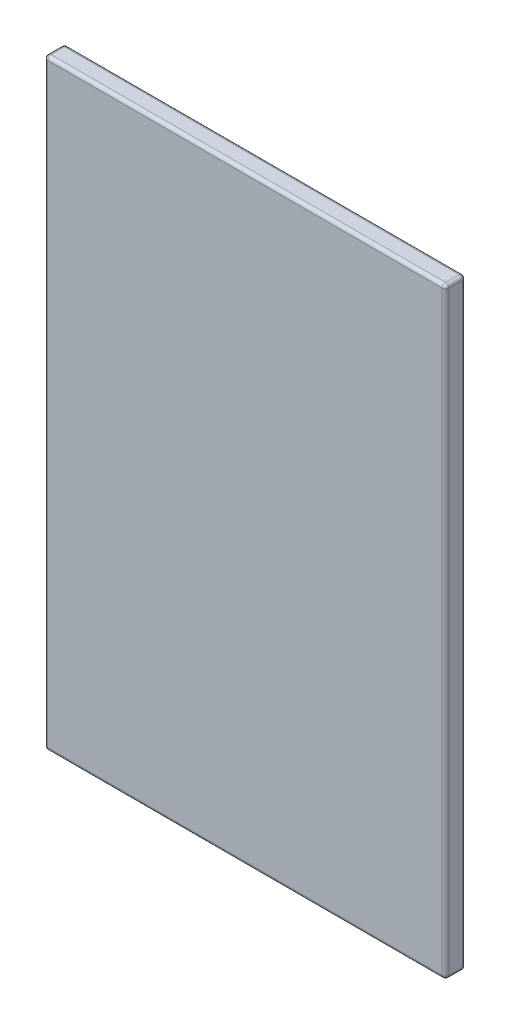
ISO-10303-21;
HEADER;
FILE_DESCRIPTION(('STEP AP214'),'2;1');
FILE_NAME('part.step','',(''),(''),'','','');
FILE_SCHEMA(('AUTOMOTIVE_DESIGN { 1 0 10303 214 1 1 1 1 }'));
ENDSEC;
DATA;
#1=APPLICATION_CONTEXT('core data for automotive mechanical design processes');
#2=APPLICATION_PROTOCOL_DEFINITION('international standard','automotive_design',2000,#1);
#3=PRODUCT_CONTEXT('',#1,'mechanical');
#4=PRODUCT('Part','Part','',(#3));
#5=PRODUCT_RELATED_PRODUCT_CATEGORY('part','',(#4));
#6=PRODUCT_DEFINITION_FORMATION('','',#4);
#7=PRODUCT_DEFINITION_CONTEXT('part definition',#1,'design');
#8=PRODUCT_DEFINITION('design','',#6,#7);
#9=PRODUCT_DEFINITION_SHAPE('','',#8);
#10=(LENGTH_UNIT() NAMED_UNIT(*) SI_UNIT(.MILLI.,.METRE.));
#11=(NAMED_UNIT(*) PLANE_ANGLE_UNIT() SI_UNIT($,.RADIAN.));
#12=(NAMED_UNIT(*) SI_UNIT($,.STERADIAN.) SOLID_ANGLE_UNIT());
#13=UNCERTAINTY_MEASURE_WITH_UNIT(LENGTH_MEASURE(1.E-05),#10,'distance_accuracy_value','');
#14=(GEOMETRIC_REPRESENTATION_CONTEXT(3) GLOBAL_UNCERTAINTY_ASSIGNED_CONTEXT((#13)) GLOBAL_UNIT_ASSIGNED_CONTEXT((#10,
#11,#12)) REPRESENTATION_CONTEXT('',''));
#15=CARTESIAN_POINT('',(0.,0.,0.));
#16=DIRECTION('',(0.,0.,1.));
#17=DIRECTION('',(1.,0.,0.));
#18=AXIS2_PLACEMENT_3D('',#15,#16,#17);
#19=CARTESIAN_POINT('',(-30.,45.,3.));
#20=DIRECTION('',(1.,0.,0.));
#21=DIRECTION('',(0.,1.,0.));
#22=AXIS2_PLACEMENT_3D('',#19,#20,#21);
#23=PLANE('',#22);
#24=DIRECTION('',(0.,0.,-1.));
#25=VECTOR('',#24,1.);
#26=CARTESIAN_POINT('',(-30.,44.5,3.));
#27=LINE('',#26,#25);
#28=CARTESIAN_POINT('',(-30.,44.5,2.5));
#29=VERTEX_POINT('',#28);
#30=CARTESIAN_POINT('',(-30.,44.5,0.5));
#31=VERTEX_POINT('',#30);
#32=EDGE_CURVE('E137',#29,#31,#27,.T.);
#33=ORIENTED_EDGE('',*,*,#32,.T.);
#34=DIRECTION('',(0.,-1.,0.));
#35=VECTOR('',#34,1.);
#36=CARTESIAN_POINT('',(-30.,45.,0.5));
#37=LINE('',#36,#35);
#38=CARTESIAN_POINT('',(-30.,-44.5,0.5));
#39=VERTEX_POINT('',#38);
#40=EDGE_CURVE('E133',#31,#39,#37,.T.);
#41=ORIENTED_EDGE('',*,*,#40,.T.);
#42=DIRECTION('',(0.,0.,-1.));
#43=VECTOR('',#42,1.);
#44=CARTESIAN_POINT('',(-30.,-44.5,3.));
#45=LINE('',#44,#43);
#46=CARTESIAN_POINT('',(-30.,-44.5,2.5));
#47=VERTEX_POINT('',#46);
#48=EDGE_CURVE('E128',#39,#47,#45,.F.);
#49=ORIENTED_EDGE('',*,*,#48,.T.);
#50=DIRECTION('',(0.,-1.,0.));
#51=VECTOR('',#50,1.);
#52=CARTESIAN_POINT('',(-30.,45.,2.5));
#53=LINE('',#52,#51);
#54=EDGE_CURVE('E130',#47,#29,#53,.F.);
#55=ORIENTED_EDGE('',*,*,#54,.T.);
#56=EDGE_LOOP('',(#33,#41,#49,#55));
#57=FACE_BOUND('',#56,.T.);
#58=ADVANCED_FACE('F35',(#57),#23,.F.);
#59=CARTESIAN_POINT('',(-30.,-45.,3.));
#60=DIRECTION('',(0.,1.,0.));
#61=DIRECTION('',(-1.,0.,0.));
#62=AXIS2_PLACEMENT_3D('',#59,#60,#61);
#63=PLANE('',#62);
#64=DIRECTION('',(1.,0.,0.));
#65=VECTOR('',#64,1.);
#66=CARTESIAN_POINT('',(-30.,-45.,0.5));
#67=LINE('',#66,#65);
#68=CARTESIAN_POINT('',(-29.5,-45.,0.5));
#69=VERTEX_POINT('',#68);
#70=CARTESIAN_POINT('',(29.5,-45.,0.5));
#71=VERTEX_POINT('',#70);
#72=EDGE_CURVE('E272',#69,#71,#67,.T.);
#73=ORIENTED_EDGE('',*,*,#72,.T.);
#74=DIRECTION('',(0.,0.,-1.));
#75=VECTOR('',#74,1.);
#76=CARTESIAN_POINT('',(29.5,-45.,3.));
#77=LINE('',#76,#75);
#78=CARTESIAN_POINT('',(29.5,-45.,2.5));
#79=VERTEX_POINT('',#78);
#80=EDGE_CURVE('E274',#71,#79,#77,.F.);
#81=ORIENTED_EDGE('',*,*,#80,.T.);
#82=DIRECTION('',(1.,0.,0.));
#83=VECTOR('',#82,1.);
#84=CARTESIAN_POINT('',(-30.,-45.,2.5));
#85=LINE('',#84,#83);
#86=CARTESIAN_POINT('',(-29.5,-45.,2.5));
#87=VERTEX_POINT('',#86);
#88=EDGE_CURVE('E270',#79,#87,#85,.F.);
#89=ORIENTED_EDGE('',*,*,#88,.T.);
#90=DIRECTION('',(0.,0.,-1.));
#91=VECTOR('',#90,1.);
#92=CARTESIAN_POINT('',(-29.5,-45.,3.));
#93=LINE('',#92,#91);
#94=EDGE_CURVE('E159',#87,#69,#93,.T.);
#95=ORIENTED_EDGE('',*,*,#94,.T.);
#96=EDGE_LOOP('',(#73,#81,#89,#95));
#97=FACE_BOUND('',#96,.T.);
#98=ADVANCED_FACE('F295',(#97),#63,.F.);
#99=CARTESIAN_POINT('',(30.,45.,3.));
#100=DIRECTION('',(-1.,0.,0.));
#101=DIRECTION('',(0.,-1.,0.));
#102=AXIS2_PLACEMENT_3D('',#99,#100,#101);
#103=PLANE('',#102);
#104=DIRECTION('',(0.,0.,-1.));
#105=VECTOR('',#104,1.);
#106=CARTESIAN_POINT('',(30.,-44.5,3.));
#107=LINE('',#106,#105);
#108=CARTESIAN_POINT('',(30.,-44.5,2.5));
#109=VERTEX_POINT('',#108);
#110=CARTESIAN_POINT('',(30.,-44.5,0.5));
#111=VERTEX_POINT('',#110);
#112=EDGE_CURVE('E265',#109,#111,#107,.T.);
#113=ORIENTED_EDGE('',*,*,#112,.T.);
#114=DIRECTION('',(0.,1.,0.));
#115=VECTOR('',#114,1.);
#116=CARTESIAN_POINT('',(30.,45.,0.5));
#117=LINE('',#116,#115);
#118=CARTESIAN_POINT('',(30.,44.5,0.5));
#119=VERTEX_POINT('',#118);
#120=EDGE_CURVE('E267',#111,#119,#117,.T.);
#121=ORIENTED_EDGE('',*,*,#120,.T.);
#122=DIRECTION('',(0.,0.,-1.));
#123=VECTOR('',#122,1.);
#124=CARTESIAN_POINT('',(30.,44.5,3.));
#125=LINE('',#124,#123);
#126=CARTESIAN_POINT('',(30.,44.5,2.5));
#127=VERTEX_POINT('',#126);
#128=EDGE_CURVE('E218',#119,#127,#125,.F.);
#129=ORIENTED_EDGE('',*,*,#128,.T.);
#130=DIRECTION('',(0.,1.,0.));
#131=VECTOR('',#130,1.);
#132=CARTESIAN_POINT('',(30.,-45.,2.5));
#133=LINE('',#132,#131);
#134=EDGE_CURVE('E259',#127,#109,#133,.F.);
#135=ORIENTED_EDGE('',*,*,#134,.T.);
#136=EDGE_LOOP('',(#113,#121,#129,#135));
#137=FACE_BOUND('',#136,.T.);
#138=ADVANCED_FACE('F311',(#137),#103,.F.);
#139=CARTESIAN_POINT('',(-30.,45.,3.));
#140=DIRECTION('',(0.,-1.,0.));
#141=DIRECTION('',(1.,0.,0.));
#142=AXIS2_PLACEMENT_3D('',#139,#140,#141);
#143=PLANE('',#142);
#144=DIRECTION('',(0.,0.,-1.));
#145=VECTOR('',#144,1.);
#146=CARTESIAN_POINT('',(29.5,45.,3.));
#147=LINE('',#146,#145);
#148=CARTESIAN_POINT('',(29.5,45.,2.5));
#149=VERTEX_POINT('',#148);
#150=CARTESIAN_POINT('',(29.5,45.,0.5));
#151=VERTEX_POINT('',#150);
#152=EDGE_CURVE('E59',#149,#151,#147,.T.);
#153=ORIENTED_EDGE('',*,*,#152,.T.);
#154=DIRECTION('',(-1.,0.,0.));
#155=VECTOR('',#154,1.);
#156=CARTESIAN_POINT('',(-30.,45.,0.5));
#157=LINE('',#156,#155);
#158=CARTESIAN_POINT('',(-29.5,45.,0.5));
#159=VERTEX_POINT('',#158);
#160=EDGE_CURVE('E11',#151,#159,#157,.T.);
#161=ORIENTED_EDGE('',*,*,#160,.T.);
#162=DIRECTION('',(0.,0.,-1.));
#163=VECTOR('',#162,1.);
#164=CARTESIAN_POINT('',(-29.5,45.,3.));
#165=LINE('',#164,#163);
#166=CARTESIAN_POINT('',(-29.5,45.,2.5));
#167=VERTEX_POINT('',#166);
#168=EDGE_CURVE('E44',#159,#167,#165,.F.);
#169=ORIENTED_EDGE('',*,*,#168,.T.);
#170=DIRECTION('',(-1.,0.,0.));
#171=VECTOR('',#170,1.);
#172=CARTESIAN_POINT('',(30.,45.,2.5));
#173=LINE('',#172,#171);
#174=EDGE_CURVE('E221',#167,#149,#173,.F.);
#175=ORIENTED_EDGE('',*,*,#174,.T.);
#176=EDGE_LOOP('',(#153,#161,#169,#175));
#177=FACE_BOUND('',#176,.T.);
#178=ADVANCED_FACE('F309',(#177),#143,.F.);
#179=CARTESIAN_POINT('',(0.,0.,3.));
#180=DIRECTION('',(0.,0.,1.));
#181=DIRECTION('',(1.,0.,0.));
#182=AXIS2_PLACEMENT_3D('',#179,#180,#181);
#183=PLANE('',#182);
#184=DIRECTION('',(0.,-1.,0.));
#185=VECTOR('',#184,1.);
#186=CARTESIAN_POINT('',(-29.5,-45.,3.));
#187=LINE('',#186,#185);
#188=CARTESIAN_POINT('',(-29.5,44.5,3.));
#189=VERTEX_POINT('',#188);
#190=CARTESIAN_POINT('',(-29.5,-44.5,3.));
#191=VERTEX_POINT('',#190);
#192=EDGE_CURVE('E279',#189,#191,#187,.T.);
#193=ORIENTED_EDGE('',*,*,#192,.T.);
#194=DIRECTION('',(1.,0.,0.));
#195=VECTOR('',#194,1.);
#196=CARTESIAN_POINT('',(30.,-44.5,3.));
#197=LINE('',#196,#195);
#198=CARTESIAN_POINT('',(29.5,-44.5,3.));
#199=VERTEX_POINT('',#198);
#200=EDGE_CURVE('E224',#191,#199,#197,.T.);
#201=ORIENTED_EDGE('',*,*,#200,.T.);
#202=DIRECTION('',(0.,1.,0.));
#203=VECTOR('',#202,1.);
#204=CARTESIAN_POINT('',(29.5,45.,3.));
#205=LINE('',#204,#203);
#206=CARTESIAN_POINT('',(29.5,44.5,3.));
#207=VERTEX_POINT('',#206);
#208=EDGE_CURVE('E281',#199,#207,#205,.T.);
#209=ORIENTED_EDGE('',*,*,#208,.T.);
#210=DIRECTION('',(-1.,0.,0.));
#211=VECTOR('',#210,1.);
#212=CARTESIAN_POINT('',(-30.,44.5,3.));
#213=LINE('',#212,#211);
#214=EDGE_CURVE('E277',#207,#189,#213,.T.);
#215=ORIENTED_EDGE('',*,*,#214,.T.);
#216=EDGE_LOOP('',(#193,#201,#209,#215));
#217=FACE_BOUND('',#216,.T.);
#218=ADVANCED_FACE('F285',(#217),#183,.T.);
#219=CARTESIAN_POINT('',(0.,0.,0.));
#220=DIRECTION('',(0.,0.,1.));
#221=DIRECTION('',(1.,0.,0.));
#222=AXIS2_PLACEMENT_3D('',#219,#220,#221);
#223=PLANE('',#222);
#224=DIRECTION('',(0.,1.,0.));
#225=VECTOR('',#224,1.);
#226=CARTESIAN_POINT('',(29.5,0.,0.));
#227=LINE('',#226,#225);
#228=CARTESIAN_POINT('',(29.5,44.5,0.));
#229=VERTEX_POINT('',#228);
#230=CARTESIAN_POINT('',(29.5,-44.5,0.));
#231=VERTEX_POINT('',#230);
#232=EDGE_CURVE('E248',#229,#231,#227,.F.);
#233=ORIENTED_EDGE('',*,*,#232,.T.);
#234=DIRECTION('',(1.,0.,0.));
#235=VECTOR('',#234,1.);
#236=CARTESIAN_POINT('',(0.,-44.5,0.));
#237=LINE('',#236,#235);
#238=CARTESIAN_POINT('',(-29.5,-44.5,0.));
#239=VERTEX_POINT('',#238);
#240=EDGE_CURVE('E254',#231,#239,#237,.F.);
#241=ORIENTED_EDGE('',*,*,#240,.T.);
#242=DIRECTION('',(0.,-1.,0.));
#243=VECTOR('',#242,1.);
#244=CARTESIAN_POINT('',(-29.5,0.,0.));
#245=LINE('',#244,#243);
#246=CARTESIAN_POINT('',(-29.5,44.5,0.));
#247=VERTEX_POINT('',#246);
#248=EDGE_CURVE('E251',#239,#247,#245,.F.);
#249=ORIENTED_EDGE('',*,*,#248,.T.);
#250=DIRECTION('',(-1.,0.,0.));
#251=VECTOR('',#250,1.);
#252=CARTESIAN_POINT('',(0.,44.5,0.));
#253=LINE('',#252,#251);
#254=EDGE_CURVE('E243',#247,#229,#253,.F.);
#255=ORIENTED_EDGE('',*,*,#254,.T.);
#256=EDGE_LOOP('',(#233,#241,#249,#255));
#257=FACE_BOUND('',#256,.T.);
#258=ADVANCED_FACE('F252',(#257),#223,.F.);
#259=CARTESIAN_POINT('',(29.5,0.,2.5));
#260=DIRECTION('',(0.,-1.,0.));
#261=DIRECTION('',(1.,0.,0.));
#262=AXIS2_PLACEMENT_3D('',#259,#260,#261);
#263=CYLINDRICAL_SURFACE('',#262,0.5);
#264=CARTESIAN_POINT('',(29.5,44.5,2.5));
#265=DIRECTION('',(0.,1.,0.));
#266=DIRECTION('',(0.,0.,1.));
#267=AXIS2_PLACEMENT_3D('',#264,#265,#266);
#268=CIRCLE('',#267,0.5);
#269=EDGE_CURVE('E39',#207,#127,#268,.T.);
#270=ORIENTED_EDGE('',*,*,#269,.F.);
#271=ORIENTED_EDGE('',*,*,#208,.F.);
#272=CARTESIAN_POINT('',(29.5,-44.5,2.5));
#273=DIRECTION('',(0.,-1.,0.));
#274=DIRECTION('',(0.,0.,-1.));
#275=AXIS2_PLACEMENT_3D('',#272,#273,#274);
#276=CIRCLE('',#275,0.5);
#277=EDGE_CURVE('E199',#109,#199,#276,.T.);
#278=ORIENTED_EDGE('',*,*,#277,.F.);
#279=ORIENTED_EDGE('',*,*,#134,.F.);
#280=EDGE_LOOP('',(#270,#271,#278,#279));
#281=FACE_BOUND('',#280,.T.);
#282=ADVANCED_FACE('F37',(#281),#263,.T.);
#283=CARTESIAN_POINT('',(29.5,44.5,2.5));
#284=DIRECTION('',(0.,0.,1.));
#285=DIRECTION('',(1.,0.,0.));
#286=AXIS2_PLACEMENT_3D('',#283,#284,#285);
#287=SPHERICAL_SURFACE('',#286,0.5);
#288=CARTESIAN_POINT('',(29.5,44.5,2.5));
#289=DIRECTION('',(1.,0.,0.));
#290=DIRECTION('',(0.,0.,-1.));
#291=AXIS2_PLACEMENT_3D('',#288,#289,#290);
#292=CIRCLE('',#291,0.5);
#293=EDGE_CURVE('E194',#207,#149,#292,.F.);
#294=ORIENTED_EDGE('',*,*,#293,.F.);
#295=ORIENTED_EDGE('',*,*,#269,.T.);
#296=CARTESIAN_POINT('',(29.5,44.5,2.5));
#297=DIRECTION('',(0.,0.,1.));
#298=DIRECTION('',(1.,0.,0.));
#299=AXIS2_PLACEMENT_3D('',#296,#297,#298);
#300=CIRCLE('',#299,0.5);
#301=EDGE_CURVE('E197',#149,#127,#300,.F.);
#302=ORIENTED_EDGE('',*,*,#301,.F.);
#303=EDGE_LOOP('',(#294,#295,#302));
#304=FACE_BOUND('',#303,.T.);
#305=ADVANCED_FACE('F211',(#304),#287,.T.);
#306=CARTESIAN_POINT('',(29.5,-44.5,2.5));
#307=DIRECTION('',(0.,0.,1.));
#308=DIRECTION('',(1.,0.,0.));
#309=AXIS2_PLACEMENT_3D('',#306,#307,#308);
#310=SPHERICAL_SURFACE('',#309,0.5);
#311=CARTESIAN_POINT('',(29.5,-44.5,2.5));
#312=DIRECTION('',(0.,0.,1.));
#313=DIRECTION('',(1.,0.,0.));
#314=AXIS2_PLACEMENT_3D('',#311,#312,#313);
#315=CIRCLE('',#314,0.5);
#316=EDGE_CURVE('E189',#109,#79,#315,.F.);
#317=ORIENTED_EDGE('',*,*,#316,.F.);
#318=ORIENTED_EDGE('',*,*,#277,.T.);
#319=CARTESIAN_POINT('',(29.5,-44.5,2.5));
#320=DIRECTION('',(1.,0.,0.));
#321=DIRECTION('',(0.,0.,-1.));
#322=AXIS2_PLACEMENT_3D('',#319,#320,#321);
#323=CIRCLE('',#322,0.5);
#324=EDGE_CURVE('E192',#79,#199,#323,.F.);
#325=ORIENTED_EDGE('',*,*,#324,.F.);
#326=EDGE_LOOP('',(#317,#318,#325));
#327=FACE_BOUND('',#326,.T.);
#328=ADVANCED_FACE('F288',(#327),#310,.T.);
#329=CARTESIAN_POINT('',(29.5,44.5,3.));
#330=DIRECTION('',(0.,0.,-1.));
#331=DIRECTION('',(-1.,0.,0.));
#332=AXIS2_PLACEMENT_3D('',#329,#330,#331);
#333=CYLINDRICAL_SURFACE('',#332,0.5);
#334=ORIENTED_EDGE('',*,*,#301,.T.);
#335=ORIENTED_EDGE('',*,*,#128,.F.);
#336=CARTESIAN_POINT('',(29.5,44.5,0.5));
#337=DIRECTION('',(0.,0.,-1.));
#338=DIRECTION('',(-1.,0.,0.));
#339=AXIS2_PLACEMENT_3D('',#336,#337,#338);
#340=CIRCLE('',#339,0.5);
#341=EDGE_CURVE('E184',#151,#119,#340,.T.);
#342=ORIENTED_EDGE('',*,*,#341,.F.);
#343=ORIENTED_EDGE('',*,*,#152,.F.);
#344=EDGE_LOOP('',(#334,#335,#342,#343));
#345=FACE_BOUND('',#344,.T.);
#346=ADVANCED_FACE('F217',(#345),#333,.T.);
#347=CARTESIAN_POINT('',(0.,44.5,2.5));
#348=DIRECTION('',(1.,0.,0.));
#349=DIRECTION('',(0.,1.,0.));
#350=AXIS2_PLACEMENT_3D('',#347,#348,#349);
#351=CYLINDRICAL_SURFACE('',#350,0.5);
#352=ORIENTED_EDGE('',*,*,#293,.T.);
#353=ORIENTED_EDGE('',*,*,#174,.F.);
#354=CARTESIAN_POINT('',(-29.5,44.5,2.5));
#355=DIRECTION('',(-1.,0.,0.));
#356=DIRECTION('',(0.,0.,1.));
#357=AXIS2_PLACEMENT_3D('',#354,#355,#356);
#358=CIRCLE('',#357,0.5);
#359=EDGE_CURVE('E181',#189,#167,#358,.T.);
#360=ORIENTED_EDGE('',*,*,#359,.F.);
#361=ORIENTED_EDGE('',*,*,#214,.F.);
#362=EDGE_LOOP('',(#352,#353,#360,#361));
#363=FACE_BOUND('',#362,.T.);
#364=ADVANCED_FACE('F366',(#363),#351,.T.);
#365=CARTESIAN_POINT('',(-29.5,0.,2.5));
#366=DIRECTION('',(0.,1.,0.));
#367=DIRECTION('',(-1.,0.,0.));
#368=AXIS2_PLACEMENT_3D('',#365,#366,#367);
#369=CYLINDRICAL_SURFACE('',#368,0.5);
#370=CARTESIAN_POINT('',(-29.5,-44.5,2.5));
#371=DIRECTION('',(0.,-1.,0.));
#372=DIRECTION('',(0.,0.,-1.));
#373=AXIS2_PLACEMENT_3D('',#370,#371,#372);
#374=CIRCLE('',#373,0.5);
#375=EDGE_CURVE('E144',#191,#47,#374,.T.);
#376=ORIENTED_EDGE('',*,*,#375,.F.);
#377=ORIENTED_EDGE('',*,*,#192,.F.);
#378=CARTESIAN_POINT('',(-29.5,44.5,2.5));
#379=DIRECTION('',(0.,1.,0.));
#380=DIRECTION('',(0.,0.,1.));
#381=AXIS2_PLACEMENT_3D('',#378,#379,#380);
#382=CIRCLE('',#381,0.5);
#383=EDGE_CURVE('E147',#29,#189,#382,.T.);
#384=ORIENTED_EDGE('',*,*,#383,.F.);
#385=ORIENTED_EDGE('',*,*,#54,.F.);
#386=EDGE_LOOP('',(#376,#377,#384,#385));
#387=FACE_BOUND('',#386,.T.);
#388=ADVANCED_FACE('F142',(#387),#369,.T.);
#389=CARTESIAN_POINT('',(0.,-44.5,2.5));
#390=DIRECTION('',(-1.,0.,0.));
#391=DIRECTION('',(0.,-1.,0.));
#392=AXIS2_PLACEMENT_3D('',#389,#390,#391);
#393=CYLINDRICAL_SURFACE('',#392,0.5);
#394=ORIENTED_EDGE('',*,*,#324,.T.);
#395=ORIENTED_EDGE('',*,*,#200,.F.);
#396=CARTESIAN_POINT('',(-29.5,-44.5,2.5));
#397=DIRECTION('',(-1.,0.,0.));
#398=DIRECTION('',(0.,0.,1.));
#399=AXIS2_PLACEMENT_3D('',#396,#397,#398);
#400=CIRCLE('',#399,0.5);
#401=EDGE_CURVE('E156',#87,#191,#400,.T.);
#402=ORIENTED_EDGE('',*,*,#401,.F.);
#403=ORIENTED_EDGE('',*,*,#88,.F.);
#404=EDGE_LOOP('',(#394,#395,#402,#403));
#405=FACE_BOUND('',#404,.T.);
#406=ADVANCED_FACE('F287',(#405),#393,.T.);
#407=CARTESIAN_POINT('',(29.5,-44.5,3.));
#408=DIRECTION('',(0.,0.,-1.));
#409=DIRECTION('',(-1.,0.,0.));
#410=AXIS2_PLACEMENT_3D('',#407,#408,#409);
#411=CYLINDRICAL_SURFACE('',#410,0.5);
#412=ORIENTED_EDGE('',*,*,#316,.T.);
#413=ORIENTED_EDGE('',*,*,#80,.F.);
#414=CARTESIAN_POINT('',(29.5,-44.5,0.5));
#415=DIRECTION('',(0.,0.,-1.));
#416=DIRECTION('',(-1.,0.,0.));
#417=AXIS2_PLACEMENT_3D('',#414,#415,#416);
#418=CIRCLE('',#417,0.5);
#419=EDGE_CURVE('E176',#111,#71,#418,.T.);
#420=ORIENTED_EDGE('',*,*,#419,.F.);
#421=ORIENTED_EDGE('',*,*,#112,.F.);
#422=EDGE_LOOP('',(#412,#413,#420,#421));
#423=FACE_BOUND('',#422,.T.);
#424=ADVANCED_FACE('F292',(#423),#411,.T.);
#425=CARTESIAN_POINT('',(29.5,45.,0.5));
#426=DIRECTION('',(0.,1.,0.));
#427=DIRECTION('',(-1.,0.,0.));
#428=AXIS2_PLACEMENT_3D('',#425,#426,#427);
#429=CYLINDRICAL_SURFACE('',#428,0.5);
#430=CARTESIAN_POINT('',(29.5,44.5,0.5));
#431=DIRECTION('',(0.,1.,0.));
#432=DIRECTION('',(0.,0.,1.));
#433=AXIS2_PLACEMENT_3D('',#430,#431,#432);
#434=CIRCLE('',#433,0.5);
#435=EDGE_CURVE('E186',#119,#229,#434,.T.);
#436=ORIENTED_EDGE('',*,*,#435,.F.);
#437=ORIENTED_EDGE('',*,*,#120,.F.);
#438=CARTESIAN_POINT('',(29.5,-44.5,0.5));
#439=DIRECTION('',(0.,-1.,0.));
#440=DIRECTION('',(0.,0.,-1.));
#441=AXIS2_PLACEMENT_3D('',#438,#439,#440);
#442=CIRCLE('',#441,0.5);
#443=EDGE_CURVE('E173',#231,#111,#442,.T.);
#444=ORIENTED_EDGE('',*,*,#443,.F.);
#445=ORIENTED_EDGE('',*,*,#232,.F.);
#446=EDGE_LOOP('',(#436,#437,#444,#445));
#447=FACE_BOUND('',#446,.T.);
#448=ADVANCED_FACE('F355',(#447),#429,.T.);
#449=CARTESIAN_POINT('',(29.5,44.5,0.5));
#450=DIRECTION('',(0.,0.,1.));
#451=DIRECTION('',(1.,0.,0.));
#452=AXIS2_PLACEMENT_3D('',#449,#450,#451);
#453=SPHERICAL_SURFACE('',#452,0.5);
#454=ORIENTED_EDGE('',*,*,#341,.T.);
#455=ORIENTED_EDGE('',*,*,#435,.T.);
#456=CARTESIAN_POINT('',(29.5,44.5,0.5));
#457=DIRECTION('',(1.,0.,0.));
#458=DIRECTION('',(0.,0.,-1.));
#459=AXIS2_PLACEMENT_3D('',#456,#457,#458);
#460=CIRCLE('',#459,0.5);
#461=EDGE_CURVE('E164',#151,#229,#460,.F.);
#462=ORIENTED_EDGE('',*,*,#461,.F.);
#463=EDGE_LOOP('',(#454,#455,#462));
#464=FACE_BOUND('',#463,.T.);
#465=ADVANCED_FACE('F351',(#464),#453,.T.);
#466=CARTESIAN_POINT('',(-29.5,44.5,2.5));
#467=DIRECTION('',(0.,0.,1.));
#468=DIRECTION('',(1.,0.,0.));
#469=AXIS2_PLACEMENT_3D('',#466,#467,#468);
#470=SPHERICAL_SURFACE('',#469,0.5);
#471=ORIENTED_EDGE('',*,*,#383,.T.);
#472=ORIENTED_EDGE('',*,*,#359,.T.);
#473=CARTESIAN_POINT('',(-29.5,44.5,2.5));
#474=DIRECTION('',(0.,0.,1.));
#475=DIRECTION('',(1.,0.,0.));
#476=AXIS2_PLACEMENT_3D('',#473,#474,#475);
#477=CIRCLE('',#476,0.5);
#478=EDGE_CURVE('E160',#29,#167,#477,.F.);
#479=ORIENTED_EDGE('',*,*,#478,.F.);
#480=EDGE_LOOP('',(#471,#472,#479));
#481=FACE_BOUND('',#480,.T.);
#482=ADVANCED_FACE('F348',(#481),#470,.T.);
#483=CARTESIAN_POINT('',(-29.5,-44.5,2.5));
#484=DIRECTION('',(0.,0.,1.));
#485=DIRECTION('',(1.,0.,0.));
#486=AXIS2_PLACEMENT_3D('',#483,#484,#485);
#487=SPHERICAL_SURFACE('',#486,0.5);
#488=ORIENTED_EDGE('',*,*,#401,.T.);
#489=ORIENTED_EDGE('',*,*,#375,.T.);
#490=CARTESIAN_POINT('',(-29.5,-44.5,2.5));
#491=DIRECTION('',(0.,0.,1.));
#492=DIRECTION('',(1.,0.,0.));
#493=AXIS2_PLACEMENT_3D('',#490,#491,#492);
#494=CIRCLE('',#493,0.5);
#495=EDGE_CURVE('E153',#87,#47,#494,.F.);
#496=ORIENTED_EDGE('',*,*,#495,.F.);
#497=EDGE_LOOP('',(#488,#489,#496));
#498=FACE_BOUND('',#497,.T.);
#499=ADVANCED_FACE('F152',(#498),#487,.T.);
#500=CARTESIAN_POINT('',(29.5,-44.5,0.5));
#501=DIRECTION('',(0.,0.,1.));
#502=DIRECTION('',(1.,0.,0.));
#503=AXIS2_PLACEMENT_3D('',#500,#501,#502);
#504=SPHERICAL_SURFACE('',#503,0.5);
#505=ORIENTED_EDGE('',*,*,#443,.T.);
#506=ORIENTED_EDGE('',*,*,#419,.T.);
#507=CARTESIAN_POINT('',(29.5,-44.5,0.5));
#508=DIRECTION('',(1.,0.,0.));
#509=DIRECTION('',(0.,0.,-1.));
#510=AXIS2_PLACEMENT_3D('',#507,#508,#509);
#511=CIRCLE('',#510,0.5);
#512=EDGE_CURVE('E161',#231,#71,#511,.F.);
#513=ORIENTED_EDGE('',*,*,#512,.F.);
#514=EDGE_LOOP('',(#505,#506,#513));
#515=FACE_BOUND('',#514,.T.);
#516=ADVANCED_FACE('F342',(#515),#504,.T.);
#517=CARTESIAN_POINT('',(-30.,44.5,0.5));
#518=DIRECTION('',(-1.,0.,0.));
#519=DIRECTION('',(0.,-1.,0.));
#520=AXIS2_PLACEMENT_3D('',#517,#518,#519);
#521=CYLINDRICAL_SURFACE('',#520,0.5);
#522=ORIENTED_EDGE('',*,*,#461,.T.);
#523=ORIENTED_EDGE('',*,*,#254,.F.);
#524=CARTESIAN_POINT('',(-29.5,44.5,0.5));
#525=DIRECTION('',(-1.,0.,0.));
#526=DIRECTION('',(0.,0.,1.));
#527=AXIS2_PLACEMENT_3D('',#524,#525,#526);
#528=CIRCLE('',#527,0.5);
#529=EDGE_CURVE('E167',#159,#247,#528,.T.);
#530=ORIENTED_EDGE('',*,*,#529,.F.);
#531=ORIENTED_EDGE('',*,*,#160,.F.);
#532=EDGE_LOOP('',(#522,#523,#530,#531));
#533=FACE_BOUND('',#532,.T.);
#534=ADVANCED_FACE('F245',(#533),#521,.T.);
#535=CARTESIAN_POINT('',(-29.5,44.5,3.));
#536=DIRECTION('',(0.,0.,-1.));
#537=DIRECTION('',(-1.,0.,0.));
#538=AXIS2_PLACEMENT_3D('',#535,#536,#537);
#539=CYLINDRICAL_SURFACE('',#538,0.5);
#540=ORIENTED_EDGE('',*,*,#478,.T.);
#541=ORIENTED_EDGE('',*,*,#168,.F.);
#542=CARTESIAN_POINT('',(-29.5,44.5,0.5));
#543=DIRECTION('',(0.,0.,-1.));
#544=DIRECTION('',(-1.,0.,0.));
#545=AXIS2_PLACEMENT_3D('',#542,#543,#544);
#546=CIRCLE('',#545,0.5);
#547=EDGE_CURVE('E52',#31,#159,#546,.T.);
#548=ORIENTED_EDGE('',*,*,#547,.F.);
#549=ORIENTED_EDGE('',*,*,#32,.F.);
#550=EDGE_LOOP('',(#540,#541,#548,#549));
#551=FACE_BOUND('',#550,.T.);
#552=ADVANCED_FACE('F307',(#551),#539,.T.);
#553=CARTESIAN_POINT('',(-29.5,-44.5,3.));
#554=DIRECTION('',(0.,0.,-1.));
#555=DIRECTION('',(-1.,0.,0.));
#556=AXIS2_PLACEMENT_3D('',#553,#554,#555);
#557=CYLINDRICAL_SURFACE('',#556,0.5);
#558=ORIENTED_EDGE('',*,*,#495,.T.);
#559=ORIENTED_EDGE('',*,*,#48,.F.);
#560=CARTESIAN_POINT('',(-29.5,-44.5,0.5));
#561=DIRECTION('',(0.,0.,-1.));
#562=DIRECTION('',(-1.,0.,0.));
#563=AXIS2_PLACEMENT_3D('',#560,#561,#562);
#564=CIRCLE('',#563,0.5);
#565=EDGE_CURVE('E235',#69,#39,#564,.T.);
#566=ORIENTED_EDGE('',*,*,#565,.F.);
#567=ORIENTED_EDGE('',*,*,#94,.F.);
#568=EDGE_LOOP('',(#558,#559,#566,#567));
#569=FACE_BOUND('',#568,.T.);
#570=ADVANCED_FACE('F158',(#569),#557,.T.);
#571=CARTESIAN_POINT('',(-30.,-44.5,0.5));
#572=DIRECTION('',(1.,0.,0.));
#573=DIRECTION('',(0.,1.,0.));
#574=AXIS2_PLACEMENT_3D('',#571,#572,#573);
#575=CYLINDRICAL_SURFACE('',#574,0.5);
#576=ORIENTED_EDGE('',*,*,#512,.T.);
#577=ORIENTED_EDGE('',*,*,#72,.F.);
#578=CARTESIAN_POINT('',(-29.5,-44.5,0.5));
#579=DIRECTION('',(-1.,0.,0.));
#580=DIRECTION('',(0.,0.,1.));
#581=AXIS2_PLACEMENT_3D('',#578,#579,#580);
#582=CIRCLE('',#581,0.5);
#583=EDGE_CURVE('E232',#239,#69,#582,.T.);
#584=ORIENTED_EDGE('',*,*,#583,.F.);
#585=ORIENTED_EDGE('',*,*,#240,.F.);
#586=EDGE_LOOP('',(#576,#577,#584,#585));
#587=FACE_BOUND('',#586,.T.);
#588=ADVANCED_FACE('F298',(#587),#575,.T.);
#589=CARTESIAN_POINT('',(-29.5,44.5,0.5));
#590=DIRECTION('',(0.,0.,1.));
#591=DIRECTION('',(1.,0.,0.));
#592=AXIS2_PLACEMENT_3D('',#589,#590,#591);
#593=SPHERICAL_SURFACE('',#592,0.5);
#594=ORIENTED_EDGE('',*,*,#547,.T.);
#595=ORIENTED_EDGE('',*,*,#529,.T.);
#596=CARTESIAN_POINT('',(-29.5,44.5,0.5));
#597=DIRECTION('',(0.,1.,0.));
#598=DIRECTION('',(0.,0.,1.));
#599=AXIS2_PLACEMENT_3D('',#596,#597,#598);
#600=CIRCLE('',#599,0.5);
#601=EDGE_CURVE('E230',#31,#247,#600,.F.);
#602=ORIENTED_EDGE('',*,*,#601,.F.);
#603=EDGE_LOOP('',(#594,#595,#602));
#604=FACE_BOUND('',#603,.T.);
#605=ADVANCED_FACE('F239',(#604),#593,.T.);
#606=CARTESIAN_POINT('',(-29.5,-44.5,0.5));
#607=DIRECTION('',(0.,0.,1.));
#608=DIRECTION('',(1.,0.,0.));
#609=AXIS2_PLACEMENT_3D('',#606,#607,#608);
#610=SPHERICAL_SURFACE('',#609,0.5);
#611=ORIENTED_EDGE('',*,*,#583,.T.);
#612=ORIENTED_EDGE('',*,*,#565,.T.);
#613=CARTESIAN_POINT('',(-29.5,-44.5,0.5));
#614=DIRECTION('',(0.,-1.,0.));
#615=DIRECTION('',(0.,0.,-1.));
#616=AXIS2_PLACEMENT_3D('',#613,#614,#615);
#617=CIRCLE('',#616,0.5);
#618=EDGE_CURVE('E228',#239,#39,#617,.F.);
#619=ORIENTED_EDGE('',*,*,#618,.F.);
#620=EDGE_LOOP('',(#611,#612,#619));
#621=FACE_BOUND('',#620,.T.);
#622=ADVANCED_FACE('F301',(#621),#610,.T.);
#623=CARTESIAN_POINT('',(-29.5,45.,0.5));
#624=DIRECTION('',(0.,-1.,0.));
#625=DIRECTION('',(1.,0.,0.));
#626=AXIS2_PLACEMENT_3D('',#623,#624,#625);
#627=CYLINDRICAL_SURFACE('',#626,0.5);
#628=ORIENTED_EDGE('',*,*,#601,.T.);
#629=ORIENTED_EDGE('',*,*,#248,.F.);
#630=ORIENTED_EDGE('',*,*,#618,.T.);
#631=ORIENTED_EDGE('',*,*,#40,.F.);
#632=EDGE_LOOP('',(#628,#629,#630,#631));
#633=FACE_BOUND('',#632,.T.);
#634=ADVANCED_FACE('F302',(#633),#627,.T.);
#635=CLOSED_SHELL('',(#58,#98,#138,#178,#218,#258,#282,#305,#328,#346,#364,#388,#406,#424,#448,
#465,#482,#499,#516,#534,#552,#570,#588,#605,#622,#634));
#636=MANIFOLD_SOLID_BREP('B2',#635);
#637=ADVANCED_BREP_SHAPE_REPRESENTATION('',(#18,#636),#14);
#638=SHAPE_DEFINITION_REPRESENTATION(#9,#637);
ENDSEC;
END-ISO-10303-21;
